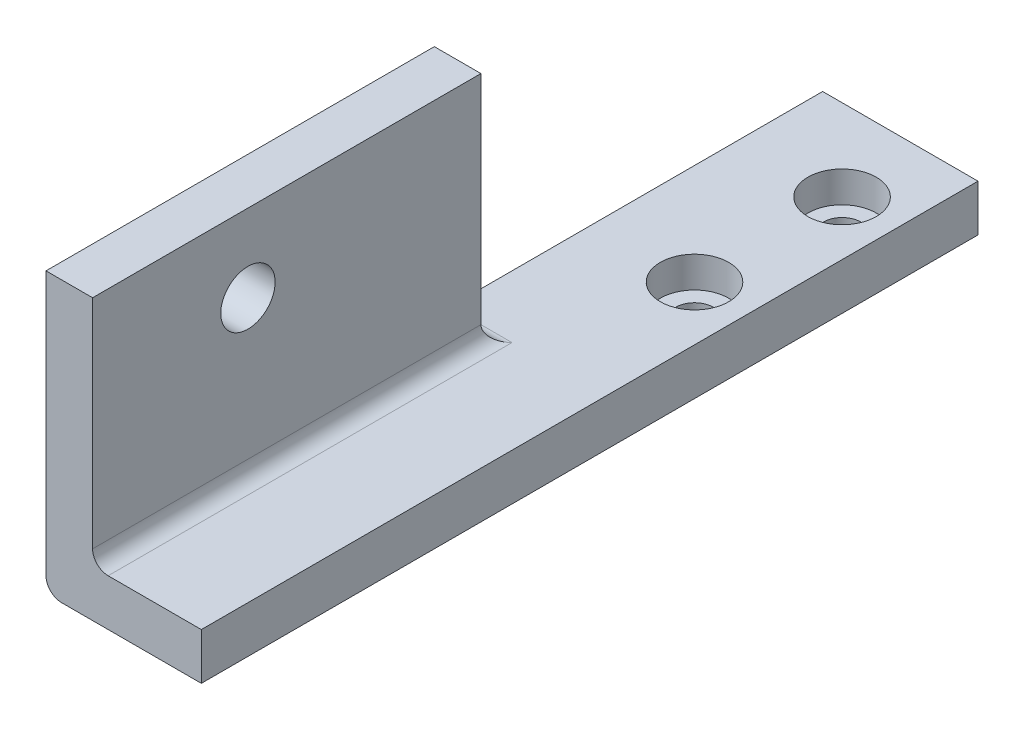
ISO-10303-21;
HEADER;
FILE_DESCRIPTION(('STEP AP214'),'2;1');
FILE_NAME('part.step','',(''),(''),'','','');
FILE_SCHEMA(('AUTOMOTIVE_DESIGN { 1 0 10303 214 1 1 1 1 }'));
ENDSEC;
DATA;
#1=APPLICATION_CONTEXT('core data for automotive mechanical design processes');
#2=APPLICATION_PROTOCOL_DEFINITION('international standard','automotive_design',2000,#1);
#3=PRODUCT_CONTEXT('',#1,'mechanical');
#4=PRODUCT('Part','Part','',(#3));
#5=PRODUCT_RELATED_PRODUCT_CATEGORY('part','',(#4));
#6=PRODUCT_DEFINITION_FORMATION('','',#4);
#7=PRODUCT_DEFINITION_CONTEXT('part definition',#1,'design');
#8=PRODUCT_DEFINITION('design','',#6,#7);
#9=PRODUCT_DEFINITION_SHAPE('','',#8);
#10=(LENGTH_UNIT() NAMED_UNIT(*) SI_UNIT(.MILLI.,.METRE.));
#11=(NAMED_UNIT(*) PLANE_ANGLE_UNIT() SI_UNIT($,.RADIAN.));
#12=(NAMED_UNIT(*) SI_UNIT($,.STERADIAN.) SOLID_ANGLE_UNIT());
#13=UNCERTAINTY_MEASURE_WITH_UNIT(LENGTH_MEASURE(1.E-05),#10,'distance_accuracy_value','');
#14=(GEOMETRIC_REPRESENTATION_CONTEXT(3) GLOBAL_UNCERTAINTY_ASSIGNED_CONTEXT((#13)) GLOBAL_UNIT_ASSIGNED_CONTEXT((#10,
#11,#12)) REPRESENTATION_CONTEXT('',''));
#15=CARTESIAN_POINT('',(0.,0.,0.));
#16=DIRECTION('',(0.,0.,1.));
#17=DIRECTION('',(1.,0.,0.));
#18=AXIS2_PLACEMENT_3D('',#15,#16,#17);
#19=CARTESIAN_POINT('',(0.,3.,0.));
#20=DIRECTION('',(0.,-1.,0.));
#21=DIRECTION('',(0.,0.,-1.));
#22=AXIS2_PLACEMENT_3D('',#19,#20,#21);
#23=PLANE('',#22);
#24=CARTESIAN_POINT('',(6.5,3.,-5.25));
#25=DIRECTION('',(0.,1.,0.));
#26=DIRECTION('',(0.,0.,1.));
#27=AXIS2_PLACEMENT_3D('',#24,#25,#26);
#28=CIRCLE('',#27,2.2);
#29=CARTESIAN_POINT('',(6.5,3.,-3.05));
#30=VERTEX_POINT('',#29);
#31=EDGE_CURVE('E170',#30,#30,#28,.T.);
#32=ORIENTED_EDGE('',*,*,#31,.F.);
#33=EDGE_LOOP('',(#32));
#34=FACE_BOUND('',#33,.T.);
#35=CARTESIAN_POINT('',(6.5,3.,-14.75));
#36=DIRECTION('',(0.,1.,0.));
#37=DIRECTION('',(0.,0.,1.));
#38=AXIS2_PLACEMENT_3D('',#35,#36,#37);
#39=CIRCLE('',#38,2.2);
#40=CARTESIAN_POINT('',(6.5,3.,-12.55));
#41=VERTEX_POINT('',#40);
#42=EDGE_CURVE('E158',#41,#41,#39,.T.);
#43=ORIENTED_EDGE('',*,*,#42,.F.);
#44=EDGE_LOOP('',(#43));
#45=FACE_BOUND('',#44,.T.);
#46=DIRECTION('',(0.,0.,1.));
#47=VECTOR('',#46,1.);
#48=CARTESIAN_POINT('',(0.,3.,0.));
#49=LINE('',#48,#47);
#50=CARTESIAN_POINT('',(0.,3.,-20.));
#51=VERTEX_POINT('',#50);
#52=CARTESIAN_POINT('',(0.,3.,4.));
#53=VERTEX_POINT('',#52);
#54=EDGE_CURVE('E183',#51,#53,#49,.T.);
#55=ORIENTED_EDGE('',*,*,#54,.T.);
#56=DIRECTION('',(-1.,0.,0.));
#57=VECTOR('',#56,1.);
#58=CARTESIAN_POINT('',(3.,3.,4.));
#59=LINE('',#58,#57);
#60=CARTESIAN_POINT('',(4.,3.,4.));
#61=VERTEX_POINT('',#60);
#62=EDGE_CURVE('E203',#53,#61,#59,.F.);
#63=ORIENTED_EDGE('',*,*,#62,.T.);
#64=DIRECTION('',(0.,0.,-1.));
#65=VECTOR('',#64,1.);
#66=CARTESIAN_POINT('',(4.,3.,30.));
#67=LINE('',#66,#65);
#68=CARTESIAN_POINT('',(4.,3.,30.));
#69=VERTEX_POINT('',#68);
#70=EDGE_CURVE('E201',#61,#69,#67,.F.);
#71=ORIENTED_EDGE('',*,*,#70,.T.);
#72=DIRECTION('',(1.,0.,0.));
#73=VECTOR('',#72,1.);
#74=CARTESIAN_POINT('',(0.,3.,30.));
#75=LINE('',#74,#73);
#76=CARTESIAN_POINT('',(10.,3.,30.));
#77=VERTEX_POINT('',#76);
#78=EDGE_CURVE('E122',#69,#77,#75,.T.);
#79=ORIENTED_EDGE('',*,*,#78,.T.);
#80=DIRECTION('',(0.,0.,-1.));
#81=VECTOR('',#80,1.);
#82=CARTESIAN_POINT('',(10.,3.,0.));
#83=LINE('',#82,#81);
#84=CARTESIAN_POINT('',(10.,3.,-20.));
#85=VERTEX_POINT('',#84);
#86=EDGE_CURVE('E186',#77,#85,#83,.T.);
#87=ORIENTED_EDGE('',*,*,#86,.T.);
#88=DIRECTION('',(-1.,0.,0.));
#89=VECTOR('',#88,1.);
#90=CARTESIAN_POINT('',(0.,3.,-20.));
#91=LINE('',#90,#89);
#92=EDGE_CURVE('E189',#85,#51,#91,.T.);
#93=ORIENTED_EDGE('',*,*,#92,.T.);
#94=EDGE_LOOP('',(#55,#63,#71,#79,#87,#93));
#95=FACE_BOUND('',#94,.T.);
#96=ADVANCED_FACE('F39',(#34,#45,#95),#23,.F.);
#97=CARTESIAN_POINT('',(0.,0.,0.));
#98=DIRECTION('',(0.,-1.,0.));
#99=DIRECTION('',(0.,0.,-1.));
#100=AXIS2_PLACEMENT_3D('',#97,#98,#99);
#101=PLANE('',#100);
#102=CARTESIAN_POINT('',(6.5,0.,-14.75));
#103=DIRECTION('',(0.,1.,0.));
#104=DIRECTION('',(0.,0.,1.));
#105=AXIS2_PLACEMENT_3D('',#102,#103,#104);
#106=CIRCLE('',#105,1.2);
#107=CARTESIAN_POINT('',(6.5,0.,-13.55));
#108=VERTEX_POINT('',#107);
#109=EDGE_CURVE('E167',#108,#108,#106,.T.);
#110=ORIENTED_EDGE('',*,*,#109,.T.);
#111=EDGE_LOOP('',(#110));
#112=FACE_BOUND('',#111,.T.);
#113=CARTESIAN_POINT('',(6.5,0.,-5.25));
#114=DIRECTION('',(0.,1.,0.));
#115=DIRECTION('',(0.,0.,1.));
#116=AXIS2_PLACEMENT_3D('',#113,#114,#115);
#117=CIRCLE('',#116,1.2);
#118=CARTESIAN_POINT('',(6.5,0.,-4.05));
#119=VERTEX_POINT('',#118);
#120=EDGE_CURVE('E179',#119,#119,#117,.T.);
#121=ORIENTED_EDGE('',*,*,#120,.T.);
#122=EDGE_LOOP('',(#121));
#123=FACE_BOUND('',#122,.T.);
#124=DIRECTION('',(-1.,0.,0.));
#125=VECTOR('',#124,1.);
#126=CARTESIAN_POINT('',(0.,0.,30.));
#127=LINE('',#126,#125);
#128=CARTESIAN_POINT('',(10.,0.,30.));
#129=VERTEX_POINT('',#128);
#130=CARTESIAN_POINT('',(1.,0.,30.));
#131=VERTEX_POINT('',#130);
#132=EDGE_CURVE('E156',#129,#131,#127,.T.);
#133=ORIENTED_EDGE('',*,*,#132,.T.);
#134=DIRECTION('',(0.,0.,1.));
#135=VECTOR('',#134,1.);
#136=CARTESIAN_POINT('',(1.,0.,-20.));
#137=LINE('',#136,#135);
#138=CARTESIAN_POINT('',(1.,0.,-20.));
#139=VERTEX_POINT('',#138);
#140=EDGE_CURVE('E47',#131,#139,#137,.F.);
#141=ORIENTED_EDGE('',*,*,#140,.T.);
#142=DIRECTION('',(-1.,0.,0.));
#143=VECTOR('',#142,1.);
#144=CARTESIAN_POINT('',(0.,0.,-20.));
#145=LINE('',#144,#143);
#146=CARTESIAN_POINT('',(10.,0.,-20.));
#147=VERTEX_POINT('',#146);
#148=EDGE_CURVE('E187',#147,#139,#145,.T.);
#149=ORIENTED_EDGE('',*,*,#148,.F.);
#150=DIRECTION('',(0.,0.,-1.));
#151=VECTOR('',#150,1.);
#152=CARTESIAN_POINT('',(10.,0.,0.));
#153=LINE('',#152,#151);
#154=EDGE_CURVE('E182',#129,#147,#153,.T.);
#155=ORIENTED_EDGE('',*,*,#154,.F.);
#156=EDGE_LOOP('',(#133,#141,#149,#155));
#157=FACE_BOUND('',#156,.T.);
#158=ADVANCED_FACE('F254',(#112,#123,#157),#101,.T.);
#159=CARTESIAN_POINT('',(0.,3.,0.));
#160=DIRECTION('',(1.,0.,0.));
#161=DIRECTION('',(0.,0.,-1.));
#162=AXIS2_PLACEMENT_3D('',#159,#160,#161);
#163=PLANE('',#162);
#164=CARTESIAN_POINT('',(0.,13.,20.));
#165=DIRECTION('',(1.,0.,0.));
#166=DIRECTION('',(0.,0.,-1.));
#167=AXIS2_PLACEMENT_3D('',#164,#165,#166);
#168=CIRCLE('',#167,1.75);
#169=CARTESIAN_POINT('',(0.,13.,18.25));
#170=VERTEX_POINT('',#169);
#171=EDGE_CURVE('E137',#170,#170,#168,.T.);
#172=ORIENTED_EDGE('',*,*,#171,.T.);
#173=EDGE_LOOP('',(#172));
#174=FACE_BOUND('',#173,.T.);
#175=DIRECTION('',(0.,-1.,0.));
#176=VECTOR('',#175,1.);
#177=CARTESIAN_POINT('',(0.,3.,-20.));
#178=LINE('',#177,#176);
#179=CARTESIAN_POINT('',(0.,1.,-20.));
#180=VERTEX_POINT('',#179);
#181=EDGE_CURVE('E191',#51,#180,#178,.T.);
#182=ORIENTED_EDGE('',*,*,#181,.T.);
#183=DIRECTION('',(0.,0.,1.));
#184=VECTOR('',#183,1.);
#185=CARTESIAN_POINT('',(0.,1.,30.));
#186=LINE('',#185,#184);
#187=CARTESIAN_POINT('',(0.,1.,30.));
#188=VERTEX_POINT('',#187);
#189=EDGE_CURVE('E121',#180,#188,#186,.T.);
#190=ORIENTED_EDGE('',*,*,#189,.T.);
#191=DIRECTION('',(0.,1.,0.));
#192=VECTOR('',#191,1.);
#193=CARTESIAN_POINT('',(0.,0.,30.));
#194=LINE('',#193,#192);
#195=CARTESIAN_POINT('',(0.,18.,30.));
#196=VERTEX_POINT('',#195);
#197=EDGE_CURVE('E113',#188,#196,#194,.T.);
#198=ORIENTED_EDGE('',*,*,#197,.T.);
#199=DIRECTION('',(0.,0.,1.));
#200=VECTOR('',#199,1.);
#201=CARTESIAN_POINT('',(0.,18.,30.));
#202=LINE('',#201,#200);
#203=CARTESIAN_POINT('',(0.,18.,5.));
#204=VERTEX_POINT('',#203);
#205=EDGE_CURVE('E119',#204,#196,#202,.T.);
#206=ORIENTED_EDGE('',*,*,#205,.F.);
#207=DIRECTION('',(0.,-1.,0.));
#208=VECTOR('',#207,1.);
#209=CARTESIAN_POINT('',(0.,18.,5.));
#210=LINE('',#209,#208);
#211=CARTESIAN_POINT('',(0.,4.,5.));
#212=VERTEX_POINT('',#211);
#213=EDGE_CURVE('E146',#204,#212,#210,.T.);
#214=ORIENTED_EDGE('',*,*,#213,.T.);
#215=CARTESIAN_POINT('',(0.,4.,4.));
#216=DIRECTION('',(1.,0.,0.));
#217=DIRECTION('',(0.,0.,-1.));
#218=AXIS2_PLACEMENT_3D('',#215,#216,#217);
#219=CIRCLE('',#218,1.);
#220=EDGE_CURVE('E207',#212,#53,#219,.T.);
#221=ORIENTED_EDGE('',*,*,#220,.T.);
#222=ORIENTED_EDGE('',*,*,#54,.F.);
#223=EDGE_LOOP('',(#182,#190,#198,#206,#214,#221,#222));
#224=FACE_BOUND('',#223,.T.);
#225=ADVANCED_FACE('F116',(#174,#224),#163,.F.);
#226=CARTESIAN_POINT('',(10.,3.,0.));
#227=DIRECTION('',(-1.,0.,0.));
#228=DIRECTION('',(0.,0.,1.));
#229=AXIS2_PLACEMENT_3D('',#226,#227,#228);
#230=PLANE('',#229);
#231=ORIENTED_EDGE('',*,*,#154,.T.);
#232=DIRECTION('',(0.,-1.,0.));
#233=VECTOR('',#232,1.);
#234=CARTESIAN_POINT('',(10.,3.,-20.));
#235=LINE('',#234,#233);
#236=EDGE_CURVE('E195',#85,#147,#235,.T.);
#237=ORIENTED_EDGE('',*,*,#236,.F.);
#238=ORIENTED_EDGE('',*,*,#86,.F.);
#239=DIRECTION('',(0.,-1.,0.));
#240=VECTOR('',#239,1.);
#241=CARTESIAN_POINT('',(10.,0.,30.));
#242=LINE('',#241,#240);
#243=EDGE_CURVE('E153',#77,#129,#242,.T.);
#244=ORIENTED_EDGE('',*,*,#243,.T.);
#245=EDGE_LOOP('',(#231,#237,#238,#244));
#246=FACE_BOUND('',#245,.T.);
#247=ADVANCED_FACE('F271',(#246),#230,.F.);
#248=CARTESIAN_POINT('',(0.,3.,-20.));
#249=DIRECTION('',(0.,0.,1.));
#250=DIRECTION('',(1.,0.,0.));
#251=AXIS2_PLACEMENT_3D('',#248,#249,#250);
#252=PLANE('',#251);
#253=ORIENTED_EDGE('',*,*,#148,.T.);
#254=CARTESIAN_POINT('',(1.,1.,-20.));
#255=DIRECTION('',(0.,0.,1.));
#256=DIRECTION('',(1.,0.,0.));
#257=AXIS2_PLACEMENT_3D('',#254,#255,#256);
#258=CIRCLE('',#257,1.);
#259=EDGE_CURVE('E11',#139,#180,#258,.F.);
#260=ORIENTED_EDGE('',*,*,#259,.T.);
#261=ORIENTED_EDGE('',*,*,#181,.F.);
#262=ORIENTED_EDGE('',*,*,#92,.F.);
#263=ORIENTED_EDGE('',*,*,#236,.T.);
#264=EDGE_LOOP('',(#253,#260,#261,#262,#263));
#265=FACE_BOUND('',#264,.T.);
#266=ADVANCED_FACE('F244',(#265),#252,.F.);
#267=CARTESIAN_POINT('',(6.5,3.,-5.25));
#268=DIRECTION('',(0.,1.,0.));
#269=DIRECTION('',(0.,0.,1.));
#270=AXIS2_PLACEMENT_3D('',#267,#268,#269);
#271=CYLINDRICAL_SURFACE('',#270,1.2);
#272=ORIENTED_EDGE('',*,*,#120,.F.);
#273=EDGE_LOOP('',(#272));
#274=FACE_BOUND('',#273,.T.);
#275=CARTESIAN_POINT('',(6.5,1.,-5.25));
#276=DIRECTION('',(0.,1.,0.));
#277=DIRECTION('',(0.,0.,1.));
#278=AXIS2_PLACEMENT_3D('',#275,#276,#277);
#279=CIRCLE('',#278,1.2);
#280=CARTESIAN_POINT('',(6.5,1.,-4.05));
#281=VERTEX_POINT('',#280);
#282=EDGE_CURVE('E176',#281,#281,#279,.T.);
#283=ORIENTED_EDGE('',*,*,#282,.T.);
#284=EDGE_LOOP('',(#283));
#285=FACE_BOUND('',#284,.T.);
#286=ADVANCED_FACE('F266',(#274,#285),#271,.F.);
#287=CARTESIAN_POINT('',(7.7,1.,-5.25));
#288=DIRECTION('',(0.,-1.,0.));
#289=DIRECTION('',(0.,0.,-1.));
#290=AXIS2_PLACEMENT_3D('',#287,#288,#289);
#291=PLANE('',#290);
#292=ORIENTED_EDGE('',*,*,#282,.F.);
#293=EDGE_LOOP('',(#292));
#294=FACE_BOUND('',#293,.T.);
#295=CARTESIAN_POINT('',(6.5,1.,-5.25));
#296=DIRECTION('',(0.,1.,0.));
#297=DIRECTION('',(0.,0.,1.));
#298=AXIS2_PLACEMENT_3D('',#295,#296,#297);
#299=CIRCLE('',#298,2.2);
#300=CARTESIAN_POINT('',(6.5,1.,-3.05));
#301=VERTEX_POINT('',#300);
#302=EDGE_CURVE('E173',#301,#301,#299,.T.);
#303=ORIENTED_EDGE('',*,*,#302,.T.);
#304=EDGE_LOOP('',(#303));
#305=FACE_BOUND('',#304,.T.);
#306=ADVANCED_FACE('F305',(#294,#305),#291,.F.);
#307=CARTESIAN_POINT('',(6.5,3.,-5.25));
#308=DIRECTION('',(0.,1.,0.));
#309=DIRECTION('',(0.,0.,1.));
#310=AXIS2_PLACEMENT_3D('',#307,#308,#309);
#311=CYLINDRICAL_SURFACE('',#310,2.2);
#312=ORIENTED_EDGE('',*,*,#302,.F.);
#313=EDGE_LOOP('',(#312));
#314=FACE_BOUND('',#313,.T.);
#315=ORIENTED_EDGE('',*,*,#31,.T.);
#316=EDGE_LOOP('',(#315));
#317=FACE_BOUND('',#316,.T.);
#318=ADVANCED_FACE('F302',(#314,#317),#311,.F.);
#319=CARTESIAN_POINT('',(6.5,3.,-14.75));
#320=DIRECTION('',(0.,1.,0.));
#321=DIRECTION('',(0.,0.,1.));
#322=AXIS2_PLACEMENT_3D('',#319,#320,#321);
#323=CYLINDRICAL_SURFACE('',#322,1.2);
#324=ORIENTED_EDGE('',*,*,#109,.F.);
#325=EDGE_LOOP('',(#324));
#326=FACE_BOUND('',#325,.T.);
#327=CARTESIAN_POINT('',(6.5,1.,-14.75));
#328=DIRECTION('',(0.,1.,0.));
#329=DIRECTION('',(0.,0.,1.));
#330=AXIS2_PLACEMENT_3D('',#327,#328,#329);
#331=CIRCLE('',#330,1.2);
#332=CARTESIAN_POINT('',(6.5,1.,-13.55));
#333=VERTEX_POINT('',#332);
#334=EDGE_CURVE('E164',#333,#333,#331,.T.);
#335=ORIENTED_EDGE('',*,*,#334,.T.);
#336=EDGE_LOOP('',(#335));
#337=FACE_BOUND('',#336,.T.);
#338=ADVANCED_FACE('F298',(#326,#337),#323,.F.);
#339=CARTESIAN_POINT('',(7.7,1.,-14.75));
#340=DIRECTION('',(0.,-1.,0.));
#341=DIRECTION('',(0.,0.,-1.));
#342=AXIS2_PLACEMENT_3D('',#339,#340,#341);
#343=PLANE('',#342);
#344=ORIENTED_EDGE('',*,*,#334,.F.);
#345=EDGE_LOOP('',(#344));
#346=FACE_BOUND('',#345,.T.);
#347=CARTESIAN_POINT('',(6.5,1.,-14.75));
#348=DIRECTION('',(0.,1.,0.));
#349=DIRECTION('',(0.,0.,1.));
#350=AXIS2_PLACEMENT_3D('',#347,#348,#349);
#351=CIRCLE('',#350,2.2);
#352=CARTESIAN_POINT('',(6.5,1.,-12.55));
#353=VERTEX_POINT('',#352);
#354=EDGE_CURVE('E161',#353,#353,#351,.T.);
#355=ORIENTED_EDGE('',*,*,#354,.T.);
#356=EDGE_LOOP('',(#355));
#357=FACE_BOUND('',#356,.T.);
#358=ADVANCED_FACE('F294',(#346,#357),#343,.F.);
#359=CARTESIAN_POINT('',(6.5,3.,-14.75));
#360=DIRECTION('',(0.,1.,0.));
#361=DIRECTION('',(0.,0.,1.));
#362=AXIS2_PLACEMENT_3D('',#359,#360,#361);
#363=CYLINDRICAL_SURFACE('',#362,2.2);
#364=ORIENTED_EDGE('',*,*,#354,.F.);
#365=EDGE_LOOP('',(#364));
#366=FACE_BOUND('',#365,.T.);
#367=ORIENTED_EDGE('',*,*,#42,.T.);
#368=EDGE_LOOP('',(#367));
#369=FACE_BOUND('',#368,.T.);
#370=ADVANCED_FACE('F291',(#366,#369),#363,.F.);
#371=CARTESIAN_POINT('',(0.,0.,30.));
#372=DIRECTION('',(0.,0.,-1.));
#373=DIRECTION('',(-1.,0.,0.));
#374=AXIS2_PLACEMENT_3D('',#371,#372,#373);
#375=PLANE('',#374);
#376=ORIENTED_EDGE('',*,*,#197,.F.);
#377=CARTESIAN_POINT('',(1.,1.,30.));
#378=DIRECTION('',(0.,0.,-1.));
#379=DIRECTION('',(-1.,0.,0.));
#380=AXIS2_PLACEMENT_3D('',#377,#378,#379);
#381=CIRCLE('',#380,1.);
#382=EDGE_CURVE('E61',#188,#131,#381,.F.);
#383=ORIENTED_EDGE('',*,*,#382,.T.);
#384=ORIENTED_EDGE('',*,*,#132,.F.);
#385=ORIENTED_EDGE('',*,*,#243,.F.);
#386=ORIENTED_EDGE('',*,*,#78,.F.);
#387=CARTESIAN_POINT('',(4.,4.,30.));
#388=DIRECTION('',(0.,0.,-1.));
#389=DIRECTION('',(-1.,0.,0.));
#390=AXIS2_PLACEMENT_3D('',#387,#388,#389);
#391=CIRCLE('',#390,1.);
#392=CARTESIAN_POINT('',(3.,4.,30.));
#393=VERTEX_POINT('',#392);
#394=EDGE_CURVE('E209',#69,#393,#391,.T.);
#395=ORIENTED_EDGE('',*,*,#394,.T.);
#396=DIRECTION('',(0.,-1.,0.));
#397=VECTOR('',#396,1.);
#398=CARTESIAN_POINT('',(3.,18.,30.));
#399=LINE('',#398,#397);
#400=CARTESIAN_POINT('',(3.,18.,30.));
#401=VERTEX_POINT('',#400);
#402=EDGE_CURVE('E123',#401,#393,#399,.T.);
#403=ORIENTED_EDGE('',*,*,#402,.F.);
#404=DIRECTION('',(1.,0.,0.));
#405=VECTOR('',#404,1.);
#406=CARTESIAN_POINT('',(0.,18.,30.));
#407=LINE('',#406,#405);
#408=EDGE_CURVE('E126',#196,#401,#407,.T.);
#409=ORIENTED_EDGE('',*,*,#408,.F.);
#410=EDGE_LOOP('',(#376,#383,#384,#385,#386,#395,#403,#409));
#411=FACE_BOUND('',#410,.T.);
#412=ADVANCED_FACE('F127',(#411),#375,.F.);
#413=CARTESIAN_POINT('',(3.,18.,30.));
#414=DIRECTION('',(-1.,0.,0.));
#415=DIRECTION('',(0.,0.,1.));
#416=AXIS2_PLACEMENT_3D('',#413,#414,#415);
#417=PLANE('',#416);
#418=CARTESIAN_POINT('',(3.,13.,20.));
#419=DIRECTION('',(1.,0.,0.));
#420=DIRECTION('',(0.,0.,-1.));
#421=AXIS2_PLACEMENT_3D('',#418,#419,#420);
#422=CIRCLE('',#421,1.75);
#423=CARTESIAN_POINT('',(3.,13.,18.25));
#424=VERTEX_POINT('',#423);
#425=EDGE_CURVE('E140',#424,#424,#422,.T.);
#426=ORIENTED_EDGE('',*,*,#425,.F.);
#427=EDGE_LOOP('',(#426));
#428=FACE_BOUND('',#427,.T.);
#429=ORIENTED_EDGE('',*,*,#402,.T.);
#430=DIRECTION('',(0.,0.,-1.));
#431=VECTOR('',#430,1.);
#432=CARTESIAN_POINT('',(3.,4.,5.));
#433=LINE('',#432,#431);
#434=CARTESIAN_POINT('',(3.,4.,5.));
#435=VERTEX_POINT('',#434);
#436=EDGE_CURVE('E205',#393,#435,#433,.T.);
#437=ORIENTED_EDGE('',*,*,#436,.T.);
#438=DIRECTION('',(0.,-1.,0.));
#439=VECTOR('',#438,1.);
#440=CARTESIAN_POINT('',(3.,18.,5.));
#441=LINE('',#440,#439);
#442=CARTESIAN_POINT('',(3.,18.,5.));
#443=VERTEX_POINT('',#442);
#444=EDGE_CURVE('E148',#443,#435,#441,.T.);
#445=ORIENTED_EDGE('',*,*,#444,.F.);
#446=DIRECTION('',(0.,0.,-1.));
#447=VECTOR('',#446,1.);
#448=CARTESIAN_POINT('',(3.,18.,30.));
#449=LINE('',#448,#447);
#450=EDGE_CURVE('E131',#401,#443,#449,.T.);
#451=ORIENTED_EDGE('',*,*,#450,.F.);
#452=EDGE_LOOP('',(#429,#437,#445,#451));
#453=FACE_BOUND('',#452,.T.);
#454=ADVANCED_FACE('F224',(#428,#453),#417,.F.);
#455=CARTESIAN_POINT('',(0.,18.,5.));
#456=DIRECTION('',(0.,0.,1.));
#457=DIRECTION('',(1.,0.,0.));
#458=AXIS2_PLACEMENT_3D('',#455,#456,#457);
#459=PLANE('',#458);
#460=ORIENTED_EDGE('',*,*,#444,.T.);
#461=DIRECTION('',(-1.,0.,0.));
#462=VECTOR('',#461,1.);
#463=CARTESIAN_POINT('',(0.,4.,5.));
#464=LINE('',#463,#462);
#465=EDGE_CURVE('E198',#435,#212,#464,.T.);
#466=ORIENTED_EDGE('',*,*,#465,.T.);
#467=ORIENTED_EDGE('',*,*,#213,.F.);
#468=DIRECTION('',(-1.,0.,0.));
#469=VECTOR('',#468,1.);
#470=CARTESIAN_POINT('',(0.,18.,5.));
#471=LINE('',#470,#469);
#472=EDGE_CURVE('E135',#443,#204,#471,.T.);
#473=ORIENTED_EDGE('',*,*,#472,.F.);
#474=EDGE_LOOP('',(#460,#466,#467,#473));
#475=FACE_BOUND('',#474,.T.);
#476=ADVANCED_FACE('F227',(#475),#459,.F.);
#477=CARTESIAN_POINT('',(0.,18.,0.));
#478=DIRECTION('',(0.,-1.,0.));
#479=DIRECTION('',(0.,0.,-1.));
#480=AXIS2_PLACEMENT_3D('',#477,#478,#479);
#481=PLANE('',#480);
#482=ORIENTED_EDGE('',*,*,#205,.T.);
#483=ORIENTED_EDGE('',*,*,#408,.T.);
#484=ORIENTED_EDGE('',*,*,#450,.T.);
#485=ORIENTED_EDGE('',*,*,#472,.T.);
#486=EDGE_LOOP('',(#482,#483,#484,#485));
#487=FACE_BOUND('',#486,.T.);
#488=ADVANCED_FACE('F133',(#487),#481,.F.);
#489=CARTESIAN_POINT('',(0.,13.,20.));
#490=DIRECTION('',(1.,0.,0.));
#491=DIRECTION('',(0.,0.,-1.));
#492=AXIS2_PLACEMENT_3D('',#489,#490,#491);
#493=CYLINDRICAL_SURFACE('',#492,1.75);
#494=ORIENTED_EDGE('',*,*,#171,.F.);
#495=EDGE_LOOP('',(#494));
#496=FACE_BOUND('',#495,.T.);
#497=ORIENTED_EDGE('',*,*,#425,.T.);
#498=EDGE_LOOP('',(#497));
#499=FACE_BOUND('',#498,.T.);
#500=ADVANCED_FACE('F222',(#496,#499),#493,.F.);
#501=CARTESIAN_POINT('',(4.,4.,30.));
#502=DIRECTION('',(0.,0.,1.));
#503=DIRECTION('',(1.,0.,0.));
#504=AXIS2_PLACEMENT_3D('',#501,#502,#503);
#505=CYLINDRICAL_SURFACE('',#504,1.);
#506=ORIENTED_EDGE('',*,*,#394,.F.);
#507=ORIENTED_EDGE('',*,*,#70,.F.);
#508=CARTESIAN_POINT('',(4.,4.,4.));
#509=DIRECTION('',(0.707106781186547,0.,0.707106781186547));
#510=DIRECTION('',(-0.707106781186547,0.,0.707106781186547));
#511=AXIS2_PLACEMENT_3D('',#508,#509,#510);
#512=ELLIPSE('',#511,1.41421356237309,1.);
#513=EDGE_CURVE('E211',#435,#61,#512,.T.);
#514=ORIENTED_EDGE('',*,*,#513,.F.);
#515=ORIENTED_EDGE('',*,*,#436,.F.);
#516=EDGE_LOOP('',(#506,#507,#514,#515));
#517=FACE_BOUND('',#516,.T.);
#518=ADVANCED_FACE('F233',(#517),#505,.F.);
#519=CARTESIAN_POINT('',(0.,4.,4.));
#520=DIRECTION('',(1.,0.,0.));
#521=DIRECTION('',(0.,0.,-1.));
#522=AXIS2_PLACEMENT_3D('',#519,#520,#521);
#523=CYLINDRICAL_SURFACE('',#522,1.);
#524=ORIENTED_EDGE('',*,*,#513,.T.);
#525=ORIENTED_EDGE('',*,*,#62,.F.);
#526=ORIENTED_EDGE('',*,*,#220,.F.);
#527=ORIENTED_EDGE('',*,*,#465,.F.);
#528=EDGE_LOOP('',(#524,#525,#526,#527));
#529=FACE_BOUND('',#528,.T.);
#530=ADVANCED_FACE('F235',(#529),#523,.F.);
#531=CARTESIAN_POINT('',(1.,1.,0.));
#532=DIRECTION('',(0.,0.,-1.));
#533=DIRECTION('',(-1.,0.,0.));
#534=AXIS2_PLACEMENT_3D('',#531,#532,#533);
#535=CYLINDRICAL_SURFACE('',#534,1.);
#536=ORIENTED_EDGE('',*,*,#259,.F.);
#537=ORIENTED_EDGE('',*,*,#140,.F.);
#538=ORIENTED_EDGE('',*,*,#382,.F.);
#539=ORIENTED_EDGE('',*,*,#189,.F.);
#540=EDGE_LOOP('',(#536,#537,#538,#539));
#541=FACE_BOUND('',#540,.T.);
#542=ADVANCED_FACE('F41',(#541),#535,.T.);
#543=CLOSED_SHELL('',(#96,#158,#225,#247,#266,#286,#306,#318,#338,#358,#370,#412,#454,#476,#488,
#500,#518,#530,#542));
#544=MANIFOLD_SOLID_BREP('B2',#543);
#545=ADVANCED_BREP_SHAPE_REPRESENTATION('',(#18,#544),#14);
#546=SHAPE_DEFINITION_REPRESENTATION(#9,#545);
ENDSEC;
END-ISO-10303-21;
